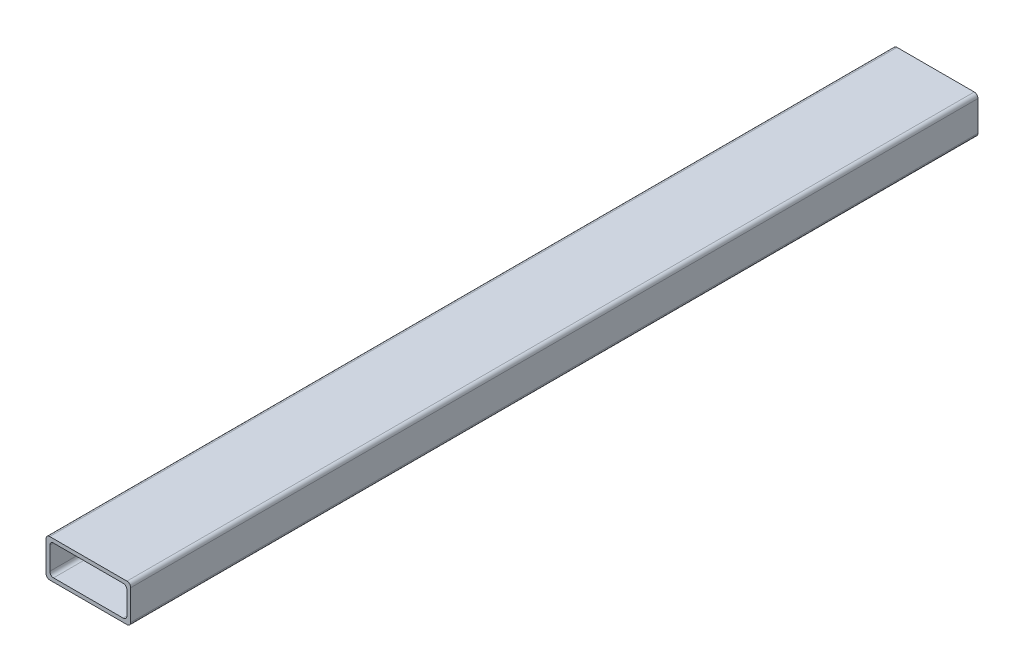
ISO-10303-21;
HEADER;
FILE_DESCRIPTION(('STEP AP214'),'2;1');
FILE_NAME('part.step','',(''),(''),'','','');
FILE_SCHEMA(('AUTOMOTIVE_DESIGN { 1 0 10303 214 1 1 1 1 }'));
ENDSEC;
DATA;
#1=APPLICATION_CONTEXT('core data for automotive mechanical design processes');
#2=APPLICATION_PROTOCOL_DEFINITION('international standard','automotive_design',2000,#1);
#3=PRODUCT_CONTEXT('',#1,'mechanical');
#4=PRODUCT('Part','Part','',(#3));
#5=PRODUCT_RELATED_PRODUCT_CATEGORY('part','',(#4));
#6=PRODUCT_DEFINITION_FORMATION('','',#4);
#7=PRODUCT_DEFINITION_CONTEXT('part definition',#1,'design');
#8=PRODUCT_DEFINITION('design','',#6,#7);
#9=PRODUCT_DEFINITION_SHAPE('','',#8);
#10=(LENGTH_UNIT() NAMED_UNIT(*) SI_UNIT(.MILLI.,.METRE.));
#11=(NAMED_UNIT(*) PLANE_ANGLE_UNIT() SI_UNIT($,.RADIAN.));
#12=(NAMED_UNIT(*) SI_UNIT($,.STERADIAN.) SOLID_ANGLE_UNIT());
#13=UNCERTAINTY_MEASURE_WITH_UNIT(LENGTH_MEASURE(1.E-05),#10,'distance_accuracy_value','');
#14=(GEOMETRIC_REPRESENTATION_CONTEXT(3) GLOBAL_UNCERTAINTY_ASSIGNED_CONTEXT((#13)) GLOBAL_UNIT_ASSIGNED_CONTEXT((#10,
#11,#12)) REPRESENTATION_CONTEXT('',''));
#15=CARTESIAN_POINT('',(0.,0.,0.));
#16=DIRECTION('',(0.,0.,1.));
#17=DIRECTION('',(1.,0.,0.));
#18=AXIS2_PLACEMENT_3D('',#15,#16,#17);
#19=CARTESIAN_POINT('',(-67.0781194232168,25.7326253085691,450.));
#20=DIRECTION('',(0.,0.,1.));
#21=DIRECTION('',(1.,0.,0.));
#22=AXIS2_PLACEMENT_3D('',#19,#20,#21);
#23=PLANE('',#22);
#24=CARTESIAN_POINT('',(-67.0781194232168,25.7326253085691,450.));
#25=DIRECTION('',(0.,0.,1.));
#26=DIRECTION('',(1.,0.,0.));
#27=AXIS2_PLACEMENT_3D('',#24,#25,#26);
#28=CIRCLE('',#27,2.);
#29=CARTESIAN_POINT('',(-67.0781194232168,27.7326253085691,450.));
#30=VERTEX_POINT('',#29);
#31=CARTESIAN_POINT('',(-69.0781194232168,25.732625308569,450.));
#32=VERTEX_POINT('',#31);
#33=EDGE_CURVE('E210',#30,#32,#28,.T.);
#34=ORIENTED_EDGE('',*,*,#33,.T.);
#35=DIRECTION('',(0.,-1.,0.));
#36=VECTOR('',#35,1.);
#37=CARTESIAN_POINT('',(-69.0781194232168,9.73262530856907,450.));
#38=LINE('',#37,#36);
#39=CARTESIAN_POINT('',(-69.0781194232168,9.73262530856907,450.));
#40=VERTEX_POINT('',#39);
#41=EDGE_CURVE('E213',#32,#40,#38,.T.);
#42=ORIENTED_EDGE('',*,*,#41,.T.);
#43=CARTESIAN_POINT('',(-67.0781194232168,9.73262530856905,450.));
#44=DIRECTION('',(0.,0.,1.));
#45=DIRECTION('',(1.,0.,0.));
#46=AXIS2_PLACEMENT_3D('',#43,#44,#45);
#47=CIRCLE('',#46,2.);
#48=CARTESIAN_POINT('',(-67.0781194232168,7.73262530856905,450.));
#49=VERTEX_POINT('',#48);
#50=EDGE_CURVE('E216',#40,#49,#47,.T.);
#51=ORIENTED_EDGE('',*,*,#50,.T.);
#52=DIRECTION('',(1.,0.,0.));
#53=VECTOR('',#52,1.);
#54=CARTESIAN_POINT('',(-67.0781194232168,7.73262530856905,450.));
#55=LINE('',#54,#53);
#56=CARTESIAN_POINT('',(-26.0781194232169,7.73262530856905,450.));
#57=VERTEX_POINT('',#56);
#58=EDGE_CURVE('E218',#49,#57,#55,.T.);
#59=ORIENTED_EDGE('',*,*,#58,.T.);
#60=CARTESIAN_POINT('',(-26.0781194232168,9.73262530856905,450.));
#61=DIRECTION('',(0.,0.,1.));
#62=DIRECTION('',(1.,0.,0.));
#63=AXIS2_PLACEMENT_3D('',#60,#61,#62);
#64=CIRCLE('',#63,2.);
#65=CARTESIAN_POINT('',(-24.0781194232168,9.73262530856907,450.));
#66=VERTEX_POINT('',#65);
#67=EDGE_CURVE('E220',#57,#66,#64,.T.);
#68=ORIENTED_EDGE('',*,*,#67,.T.);
#69=DIRECTION('',(0.,1.,0.));
#70=VECTOR('',#69,1.);
#71=CARTESIAN_POINT('',(-24.0781194232168,25.732625308569,450.));
#72=LINE('',#71,#70);
#73=CARTESIAN_POINT('',(-24.0781194232168,25.732625308569,450.));
#74=VERTEX_POINT('',#73);
#75=EDGE_CURVE('E222',#66,#74,#72,.T.);
#76=ORIENTED_EDGE('',*,*,#75,.T.);
#77=CARTESIAN_POINT('',(-26.0781194232168,25.7326253085691,450.));
#78=DIRECTION('',(0.,0.,1.));
#79=DIRECTION('',(1.,0.,0.));
#80=AXIS2_PLACEMENT_3D('',#77,#78,#79);
#81=CIRCLE('',#80,2.);
#82=CARTESIAN_POINT('',(-26.0781194232169,27.7326253085691,450.));
#83=VERTEX_POINT('',#82);
#84=EDGE_CURVE('E224',#74,#83,#81,.T.);
#85=ORIENTED_EDGE('',*,*,#84,.T.);
#86=DIRECTION('',(-1.,0.,0.));
#87=VECTOR('',#86,1.);
#88=CARTESIAN_POINT('',(-67.0781194232168,27.7326253085691,450.));
#89=LINE('',#88,#87);
#90=EDGE_CURVE('E226',#83,#30,#89,.T.);
#91=ORIENTED_EDGE('',*,*,#90,.T.);
#92=EDGE_LOOP('',(#34,#42,#51,#59,#68,#76,#85,#91));
#93=FACE_BOUND('',#92,.T.);
#94=DIRECTION('',(0.,-1.,0.));
#95=VECTOR('',#94,1.);
#96=CARTESIAN_POINT('',(-67.0781194232168,11.7326253085691,450.));
#97=LINE('',#96,#95);
#98=CARTESIAN_POINT('',(-67.0781194232168,23.732625308569,450.));
#99=VERTEX_POINT('',#98);
#100=CARTESIAN_POINT('',(-67.0781194232168,11.7326253085691,450.));
#101=VERTEX_POINT('',#100);
#102=EDGE_CURVE('E153',#99,#101,#97,.T.);
#103=ORIENTED_EDGE('',*,*,#102,.F.);
#104=CARTESIAN_POINT('',(-65.0781194232168,23.7326253085691,450.));
#105=DIRECTION('',(0.,0.,1.));
#106=DIRECTION('',(1.,0.,0.));
#107=AXIS2_PLACEMENT_3D('',#104,#105,#106);
#108=CIRCLE('',#107,2.);
#109=CARTESIAN_POINT('',(-65.0781194232168,25.7326253085691,450.));
#110=VERTEX_POINT('',#109);
#111=EDGE_CURVE('E145',#110,#99,#108,.T.);
#112=ORIENTED_EDGE('',*,*,#111,.F.);
#113=DIRECTION('',(-1.,0.,0.));
#114=VECTOR('',#113,1.);
#115=CARTESIAN_POINT('',(-65.0781194232168,25.7326253085691,450.));
#116=LINE('',#115,#114);
#117=CARTESIAN_POINT('',(-28.0781194232169,25.7326253085691,450.));
#118=VERTEX_POINT('',#117);
#119=EDGE_CURVE('E178',#118,#110,#116,.T.);
#120=ORIENTED_EDGE('',*,*,#119,.F.);
#121=CARTESIAN_POINT('',(-28.0781194232168,23.7326253085691,450.));
#122=DIRECTION('',(0.,0.,1.));
#123=DIRECTION('',(1.,0.,0.));
#124=AXIS2_PLACEMENT_3D('',#121,#122,#123);
#125=CIRCLE('',#124,2.);
#126=CARTESIAN_POINT('',(-26.0781194232168,23.732625308569,450.));
#127=VERTEX_POINT('',#126);
#128=EDGE_CURVE('E176',#127,#118,#125,.T.);
#129=ORIENTED_EDGE('',*,*,#128,.F.);
#130=DIRECTION('',(0.,1.,0.));
#131=VECTOR('',#130,1.);
#132=CARTESIAN_POINT('',(-26.0781194232168,23.732625308569,450.));
#133=LINE('',#132,#131);
#134=CARTESIAN_POINT('',(-26.0781194232168,11.7326253085691,450.));
#135=VERTEX_POINT('',#134);
#136=EDGE_CURVE('E174',#135,#127,#133,.T.);
#137=ORIENTED_EDGE('',*,*,#136,.F.);
#138=CARTESIAN_POINT('',(-28.0781194232168,11.7326253085691,450.));
#139=DIRECTION('',(0.,0.,1.));
#140=DIRECTION('',(1.,0.,0.));
#141=AXIS2_PLACEMENT_3D('',#138,#139,#140);
#142=CIRCLE('',#141,2.);
#143=CARTESIAN_POINT('',(-28.0781194232169,9.73262530856905,450.));
#144=VERTEX_POINT('',#143);
#145=EDGE_CURVE('E172',#144,#135,#142,.T.);
#146=ORIENTED_EDGE('',*,*,#145,.F.);
#147=DIRECTION('',(1.,0.,0.));
#148=VECTOR('',#147,1.);
#149=CARTESIAN_POINT('',(-65.0781194232168,9.73262530856905,450.));
#150=LINE('',#149,#148);
#151=CARTESIAN_POINT('',(-65.0781194232168,9.73262530856905,450.));
#152=VERTEX_POINT('',#151);
#153=EDGE_CURVE('E168',#152,#144,#150,.T.);
#154=ORIENTED_EDGE('',*,*,#153,.F.);
#155=CARTESIAN_POINT('',(-65.0781194232168,11.7326253085691,450.));
#156=DIRECTION('',(0.,0.,1.));
#157=DIRECTION('',(1.,0.,0.));
#158=AXIS2_PLACEMENT_3D('',#155,#156,#157);
#159=CIRCLE('',#158,2.);
#160=EDGE_CURVE('E166',#101,#152,#159,.T.);
#161=ORIENTED_EDGE('',*,*,#160,.F.);
#162=EDGE_LOOP('',(#103,#112,#120,#129,#137,#146,#154,#161));
#163=FACE_BOUND('',#162,.T.);
#164=ADVANCED_FACE('F32',(#93,#163),#23,.T.);
#165=CARTESIAN_POINT('',(-67.0781194232168,25.7326253085691,0.));
#166=DIRECTION('',(0.,0.,1.));
#167=DIRECTION('',(1.,0.,0.));
#168=AXIS2_PLACEMENT_3D('',#165,#166,#167);
#169=PLANE('',#168);
#170=CARTESIAN_POINT('',(-67.0781194232168,25.7326253085691,0.));
#171=DIRECTION('',(0.,0.,1.));
#172=DIRECTION('',(1.,0.,0.));
#173=AXIS2_PLACEMENT_3D('',#170,#171,#172);
#174=CIRCLE('',#173,2.);
#175=CARTESIAN_POINT('',(-67.0781194232168,27.7326253085691,0.));
#176=VERTEX_POINT('',#175);
#177=CARTESIAN_POINT('',(-69.0781194232168,25.732625308569,0.));
#178=VERTEX_POINT('',#177);
#179=EDGE_CURVE('E161',#176,#178,#174,.T.);
#180=ORIENTED_EDGE('',*,*,#179,.F.);
#181=DIRECTION('',(-1.,0.,0.));
#182=VECTOR('',#181,1.);
#183=CARTESIAN_POINT('',(-67.0781194232168,27.7326253085691,0.));
#184=LINE('',#183,#182);
#185=CARTESIAN_POINT('',(-26.0781194232169,27.7326253085691,0.));
#186=VERTEX_POINT('',#185);
#187=EDGE_CURVE('E214',#186,#176,#184,.T.);
#188=ORIENTED_EDGE('',*,*,#187,.F.);
#189=CARTESIAN_POINT('',(-26.0781194232168,25.7326253085691,0.));
#190=DIRECTION('',(0.,0.,1.));
#191=DIRECTION('',(1.,0.,0.));
#192=AXIS2_PLACEMENT_3D('',#189,#190,#191);
#193=CIRCLE('',#192,2.);
#194=CARTESIAN_POINT('',(-24.0781194232168,25.732625308569,0.));
#195=VERTEX_POINT('',#194);
#196=EDGE_CURVE('E241',#195,#186,#193,.T.);
#197=ORIENTED_EDGE('',*,*,#196,.F.);
#198=DIRECTION('',(0.,1.,0.));
#199=VECTOR('',#198,1.);
#200=CARTESIAN_POINT('',(-24.0781194232168,25.732625308569,0.));
#201=LINE('',#200,#199);
#202=CARTESIAN_POINT('',(-24.0781194232168,9.73262530856907,0.));
#203=VERTEX_POINT('',#202);
#204=EDGE_CURVE('E239',#203,#195,#201,.T.);
#205=ORIENTED_EDGE('',*,*,#204,.F.);
#206=CARTESIAN_POINT('',(-26.0781194232168,9.73262530856905,0.));
#207=DIRECTION('',(0.,0.,1.));
#208=DIRECTION('',(1.,0.,0.));
#209=AXIS2_PLACEMENT_3D('',#206,#207,#208);
#210=CIRCLE('',#209,2.);
#211=CARTESIAN_POINT('',(-26.0781194232169,7.73262530856905,0.));
#212=VERTEX_POINT('',#211);
#213=EDGE_CURVE('E237',#212,#203,#210,.T.);
#214=ORIENTED_EDGE('',*,*,#213,.F.);
#215=DIRECTION('',(1.,0.,0.));
#216=VECTOR('',#215,1.);
#217=CARTESIAN_POINT('',(-67.0781194232168,7.73262530856905,0.));
#218=LINE('',#217,#216);
#219=CARTESIAN_POINT('',(-67.0781194232168,7.73262530856905,0.));
#220=VERTEX_POINT('',#219);
#221=EDGE_CURVE('E235',#220,#212,#218,.T.);
#222=ORIENTED_EDGE('',*,*,#221,.F.);
#223=CARTESIAN_POINT('',(-67.0781194232168,9.73262530856905,0.));
#224=DIRECTION('',(0.,0.,1.));
#225=DIRECTION('',(1.,0.,0.));
#226=AXIS2_PLACEMENT_3D('',#223,#224,#225);
#227=CIRCLE('',#226,2.);
#228=CARTESIAN_POINT('',(-69.0781194232168,9.73262530856907,0.));
#229=VERTEX_POINT('',#228);
#230=EDGE_CURVE('E233',#229,#220,#227,.T.);
#231=ORIENTED_EDGE('',*,*,#230,.F.);
#232=DIRECTION('',(0.,-1.,0.));
#233=VECTOR('',#232,1.);
#234=CARTESIAN_POINT('',(-69.0781194232168,9.73262530856907,0.));
#235=LINE('',#234,#233);
#236=EDGE_CURVE('E231',#178,#229,#235,.T.);
#237=ORIENTED_EDGE('',*,*,#236,.F.);
#238=EDGE_LOOP('',(#180,#188,#197,#205,#214,#222,#231,#237));
#239=FACE_BOUND('',#238,.T.);
#240=CARTESIAN_POINT('',(-65.0781194232168,23.7326253085691,0.));
#241=DIRECTION('',(0.,0.,1.));
#242=DIRECTION('',(1.,0.,0.));
#243=AXIS2_PLACEMENT_3D('',#240,#241,#242);
#244=CIRCLE('',#243,2.);
#245=CARTESIAN_POINT('',(-65.0781194232168,25.7326253085691,0.));
#246=VERTEX_POINT('',#245);
#247=CARTESIAN_POINT('',(-67.0781194232168,23.732625308569,0.));
#248=VERTEX_POINT('',#247);
#249=EDGE_CURVE('E55',#246,#248,#244,.T.);
#250=ORIENTED_EDGE('',*,*,#249,.T.);
#251=DIRECTION('',(0.,-1.,0.));
#252=VECTOR('',#251,1.);
#253=CARTESIAN_POINT('',(-67.0781194232168,11.7326253085691,0.));
#254=LINE('',#253,#252);
#255=CARTESIAN_POINT('',(-67.0781194232168,11.7326253085691,0.));
#256=VERTEX_POINT('',#255);
#257=EDGE_CURVE('E160',#248,#256,#254,.T.);
#258=ORIENTED_EDGE('',*,*,#257,.T.);
#259=CARTESIAN_POINT('',(-65.0781194232168,11.7326253085691,0.));
#260=DIRECTION('',(0.,0.,1.));
#261=DIRECTION('',(1.,0.,0.));
#262=AXIS2_PLACEMENT_3D('',#259,#260,#261);
#263=CIRCLE('',#262,2.);
#264=CARTESIAN_POINT('',(-65.0781194232168,9.73262530856905,0.));
#265=VERTEX_POINT('',#264);
#266=EDGE_CURVE('E182',#256,#265,#263,.T.);
#267=ORIENTED_EDGE('',*,*,#266,.T.);
#268=DIRECTION('',(1.,0.,0.));
#269=VECTOR('',#268,1.);
#270=CARTESIAN_POINT('',(-65.0781194232168,9.73262530856905,0.));
#271=LINE('',#270,#269);
#272=CARTESIAN_POINT('',(-28.0781194232169,9.73262530856905,0.));
#273=VERTEX_POINT('',#272);
#274=EDGE_CURVE('E185',#265,#273,#271,.T.);
#275=ORIENTED_EDGE('',*,*,#274,.T.);
#276=CARTESIAN_POINT('',(-28.0781194232168,11.7326253085691,0.));
#277=DIRECTION('',(0.,0.,1.));
#278=DIRECTION('',(1.,0.,0.));
#279=AXIS2_PLACEMENT_3D('',#276,#277,#278);
#280=CIRCLE('',#279,2.);
#281=CARTESIAN_POINT('',(-26.0781194232168,11.7326253085691,0.));
#282=VERTEX_POINT('',#281);
#283=EDGE_CURVE('E188',#273,#282,#280,.T.);
#284=ORIENTED_EDGE('',*,*,#283,.T.);
#285=DIRECTION('',(0.,1.,0.));
#286=VECTOR('',#285,1.);
#287=CARTESIAN_POINT('',(-26.0781194232168,23.732625308569,0.));
#288=LINE('',#287,#286);
#289=CARTESIAN_POINT('',(-26.0781194232168,23.732625308569,0.));
#290=VERTEX_POINT('',#289);
#291=EDGE_CURVE('E191',#282,#290,#288,.T.);
#292=ORIENTED_EDGE('',*,*,#291,.T.);
#293=CARTESIAN_POINT('',(-28.0781194232168,23.7326253085691,0.));
#294=DIRECTION('',(0.,0.,1.));
#295=DIRECTION('',(1.,0.,0.));
#296=AXIS2_PLACEMENT_3D('',#293,#294,#295);
#297=CIRCLE('',#296,2.);
#298=CARTESIAN_POINT('',(-28.0781194232169,25.7326253085691,0.));
#299=VERTEX_POINT('',#298);
#300=EDGE_CURVE('E194',#290,#299,#297,.T.);
#301=ORIENTED_EDGE('',*,*,#300,.T.);
#302=DIRECTION('',(-1.,0.,0.));
#303=VECTOR('',#302,1.);
#304=CARTESIAN_POINT('',(-65.0781194232168,25.7326253085691,0.));
#305=LINE('',#304,#303);
#306=EDGE_CURVE('E154',#299,#246,#305,.T.);
#307=ORIENTED_EDGE('',*,*,#306,.T.);
#308=EDGE_LOOP('',(#250,#258,#267,#275,#284,#292,#301,#307));
#309=FACE_BOUND('',#308,.T.);
#310=ADVANCED_FACE('F271',(#239,#309),#169,.F.);
#311=CARTESIAN_POINT('',(-67.0781194232168,25.7326253085691,450.));
#312=DIRECTION('',(0.,0.,-1.));
#313=DIRECTION('',(-1.,0.,0.));
#314=AXIS2_PLACEMENT_3D('',#311,#312,#313);
#315=CYLINDRICAL_SURFACE('',#314,2.);
#316=ORIENTED_EDGE('',*,*,#179,.T.);
#317=DIRECTION('',(0.,0.,-1.));
#318=VECTOR('',#317,1.);
#319=CARTESIAN_POINT('',(-69.0781194232168,25.732625308569,450.));
#320=LINE('',#319,#318);
#321=EDGE_CURVE('E11',#32,#178,#320,.T.);
#322=ORIENTED_EDGE('',*,*,#321,.F.);
#323=ORIENTED_EDGE('',*,*,#33,.F.);
#324=DIRECTION('',(0.,0.,-1.));
#325=VECTOR('',#324,1.);
#326=CARTESIAN_POINT('',(-67.0781194232168,27.7326253085691,450.));
#327=LINE('',#326,#325);
#328=EDGE_CURVE('E228',#30,#176,#327,.T.);
#329=ORIENTED_EDGE('',*,*,#328,.T.);
#330=EDGE_LOOP('',(#316,#322,#323,#329));
#331=FACE_BOUND('',#330,.T.);
#332=ADVANCED_FACE('F34',(#331),#315,.T.);
#333=CARTESIAN_POINT('',(-69.0781194232168,9.73262530856907,450.));
#334=DIRECTION('',(1.,0.,0.));
#335=DIRECTION('',(0.,0.,-1.));
#336=AXIS2_PLACEMENT_3D('',#333,#334,#335);
#337=PLANE('',#336);
#338=ORIENTED_EDGE('',*,*,#236,.T.);
#339=DIRECTION('',(0.,0.,-1.));
#340=VECTOR('',#339,1.);
#341=CARTESIAN_POINT('',(-69.0781194232168,9.73262530856907,450.));
#342=LINE('',#341,#340);
#343=EDGE_CURVE('E40',#40,#229,#342,.T.);
#344=ORIENTED_EDGE('',*,*,#343,.F.);
#345=ORIENTED_EDGE('',*,*,#41,.F.);
#346=ORIENTED_EDGE('',*,*,#321,.T.);
#347=EDGE_LOOP('',(#338,#344,#345,#346));
#348=FACE_BOUND('',#347,.T.);
#349=ADVANCED_FACE('F288',(#348),#337,.F.);
#350=CARTESIAN_POINT('',(-67.0781194232168,9.73262530856905,450.));
#351=DIRECTION('',(0.,0.,-1.));
#352=DIRECTION('',(-1.,0.,0.));
#353=AXIS2_PLACEMENT_3D('',#350,#351,#352);
#354=CYLINDRICAL_SURFACE('',#353,2.);
#355=ORIENTED_EDGE('',*,*,#230,.T.);
#356=DIRECTION('',(0.,0.,-1.));
#357=VECTOR('',#356,1.);
#358=CARTESIAN_POINT('',(-67.0781194232168,7.73262530856905,450.));
#359=LINE('',#358,#357);
#360=EDGE_CURVE('E258',#49,#220,#359,.T.);
#361=ORIENTED_EDGE('',*,*,#360,.F.);
#362=ORIENTED_EDGE('',*,*,#50,.F.);
#363=ORIENTED_EDGE('',*,*,#343,.T.);
#364=EDGE_LOOP('',(#355,#361,#362,#363));
#365=FACE_BOUND('',#364,.T.);
#366=ADVANCED_FACE('F265',(#365),#354,.T.);
#367=CARTESIAN_POINT('',(-67.0781194232168,7.73262530856905,450.));
#368=DIRECTION('',(0.,1.,0.));
#369=DIRECTION('',(0.,0.,1.));
#370=AXIS2_PLACEMENT_3D('',#367,#368,#369);
#371=PLANE('',#370);
#372=ORIENTED_EDGE('',*,*,#221,.T.);
#373=DIRECTION('',(0.,0.,-1.));
#374=VECTOR('',#373,1.);
#375=CARTESIAN_POINT('',(-26.0781194232169,7.73262530856905,450.));
#376=LINE('',#375,#374);
#377=EDGE_CURVE('E255',#57,#212,#376,.T.);
#378=ORIENTED_EDGE('',*,*,#377,.F.);
#379=ORIENTED_EDGE('',*,*,#58,.F.);
#380=ORIENTED_EDGE('',*,*,#360,.T.);
#381=EDGE_LOOP('',(#372,#378,#379,#380));
#382=FACE_BOUND('',#381,.T.);
#383=ADVANCED_FACE('F277',(#382),#371,.F.);
#384=CARTESIAN_POINT('',(-26.0781194232168,9.73262530856905,450.));
#385=DIRECTION('',(0.,0.,-1.));
#386=DIRECTION('',(-1.,0.,0.));
#387=AXIS2_PLACEMENT_3D('',#384,#385,#386);
#388=CYLINDRICAL_SURFACE('',#387,2.);
#389=ORIENTED_EDGE('',*,*,#213,.T.);
#390=DIRECTION('',(0.,0.,-1.));
#391=VECTOR('',#390,1.);
#392=CARTESIAN_POINT('',(-24.0781194232168,9.73262530856907,450.));
#393=LINE('',#392,#391);
#394=EDGE_CURVE('E252',#66,#203,#393,.T.);
#395=ORIENTED_EDGE('',*,*,#394,.F.);
#396=ORIENTED_EDGE('',*,*,#67,.F.);
#397=ORIENTED_EDGE('',*,*,#377,.T.);
#398=EDGE_LOOP('',(#389,#395,#396,#397));
#399=FACE_BOUND('',#398,.T.);
#400=ADVANCED_FACE('F281',(#399),#388,.T.);
#401=CARTESIAN_POINT('',(-24.0781194232168,25.732625308569,450.));
#402=DIRECTION('',(-1.,0.,0.));
#403=DIRECTION('',(0.,0.,1.));
#404=AXIS2_PLACEMENT_3D('',#401,#402,#403);
#405=PLANE('',#404);
#406=ORIENTED_EDGE('',*,*,#204,.T.);
#407=DIRECTION('',(0.,0.,-1.));
#408=VECTOR('',#407,1.);
#409=CARTESIAN_POINT('',(-24.0781194232168,25.732625308569,450.));
#410=LINE('',#409,#408);
#411=EDGE_CURVE('E249',#74,#195,#410,.T.);
#412=ORIENTED_EDGE('',*,*,#411,.F.);
#413=ORIENTED_EDGE('',*,*,#75,.F.);
#414=ORIENTED_EDGE('',*,*,#394,.T.);
#415=EDGE_LOOP('',(#406,#412,#413,#414));
#416=FACE_BOUND('',#415,.T.);
#417=ADVANCED_FACE('F301',(#416),#405,.F.);
#418=CARTESIAN_POINT('',(-26.0781194232168,25.7326253085691,450.));
#419=DIRECTION('',(0.,0.,-1.));
#420=DIRECTION('',(-1.,0.,0.));
#421=AXIS2_PLACEMENT_3D('',#418,#419,#420);
#422=CYLINDRICAL_SURFACE('',#421,2.);
#423=ORIENTED_EDGE('',*,*,#196,.T.);
#424=DIRECTION('',(0.,0.,-1.));
#425=VECTOR('',#424,1.);
#426=CARTESIAN_POINT('',(-26.0781194232169,27.7326253085691,450.));
#427=LINE('',#426,#425);
#428=EDGE_CURVE('E246',#83,#186,#427,.T.);
#429=ORIENTED_EDGE('',*,*,#428,.F.);
#430=ORIENTED_EDGE('',*,*,#84,.F.);
#431=ORIENTED_EDGE('',*,*,#411,.T.);
#432=EDGE_LOOP('',(#423,#429,#430,#431));
#433=FACE_BOUND('',#432,.T.);
#434=ADVANCED_FACE('F299',(#433),#422,.T.);
#435=CARTESIAN_POINT('',(-67.0781194232168,27.7326253085691,450.));
#436=DIRECTION('',(0.,-1.,0.));
#437=DIRECTION('',(0.,0.,-1.));
#438=AXIS2_PLACEMENT_3D('',#435,#436,#437);
#439=PLANE('',#438);
#440=ORIENTED_EDGE('',*,*,#187,.T.);
#441=ORIENTED_EDGE('',*,*,#328,.F.);
#442=ORIENTED_EDGE('',*,*,#90,.F.);
#443=ORIENTED_EDGE('',*,*,#428,.T.);
#444=EDGE_LOOP('',(#440,#441,#442,#443));
#445=FACE_BOUND('',#444,.T.);
#446=ADVANCED_FACE('F294',(#445),#439,.F.);
#447=CARTESIAN_POINT('',(-65.0781194232168,23.7326253085691,450.));
#448=DIRECTION('',(0.,0.,-1.));
#449=DIRECTION('',(-1.,0.,0.));
#450=AXIS2_PLACEMENT_3D('',#447,#448,#449);
#451=CYLINDRICAL_SURFACE('',#450,2.);
#452=ORIENTED_EDGE('',*,*,#249,.F.);
#453=DIRECTION('',(0.,0.,-1.));
#454=VECTOR('',#453,1.);
#455=CARTESIAN_POINT('',(-65.0781194232168,25.7326253085691,450.));
#456=LINE('',#455,#454);
#457=EDGE_CURVE('E149',#110,#246,#456,.T.);
#458=ORIENTED_EDGE('',*,*,#457,.F.);
#459=ORIENTED_EDGE('',*,*,#111,.T.);
#460=DIRECTION('',(0.,0.,-1.));
#461=VECTOR('',#460,1.);
#462=CARTESIAN_POINT('',(-67.0781194232168,23.732625308569,450.));
#463=LINE('',#462,#461);
#464=EDGE_CURVE('E148',#99,#248,#463,.T.);
#465=ORIENTED_EDGE('',*,*,#464,.T.);
#466=EDGE_LOOP('',(#452,#458,#459,#465));
#467=FACE_BOUND('',#466,.T.);
#468=ADVANCED_FACE('F147',(#467),#451,.F.);
#469=CARTESIAN_POINT('',(-67.0781194232168,11.7326253085691,450.));
#470=DIRECTION('',(1.,0.,0.));
#471=DIRECTION('',(0.,0.,-1.));
#472=AXIS2_PLACEMENT_3D('',#469,#470,#471);
#473=PLANE('',#472);
#474=ORIENTED_EDGE('',*,*,#257,.F.);
#475=ORIENTED_EDGE('',*,*,#464,.F.);
#476=ORIENTED_EDGE('',*,*,#102,.T.);
#477=DIRECTION('',(0.,0.,-1.));
#478=VECTOR('',#477,1.);
#479=CARTESIAN_POINT('',(-67.0781194232168,11.7326253085691,450.));
#480=LINE('',#479,#478);
#481=EDGE_CURVE('E162',#101,#256,#480,.T.);
#482=ORIENTED_EDGE('',*,*,#481,.T.);
#483=EDGE_LOOP('',(#474,#475,#476,#482));
#484=FACE_BOUND('',#483,.T.);
#485=ADVANCED_FACE('F157',(#484),#473,.T.);
#486=CARTESIAN_POINT('',(-65.0781194232168,11.7326253085691,450.));
#487=DIRECTION('',(0.,0.,-1.));
#488=DIRECTION('',(-1.,0.,0.));
#489=AXIS2_PLACEMENT_3D('',#486,#487,#488);
#490=CYLINDRICAL_SURFACE('',#489,2.);
#491=ORIENTED_EDGE('',*,*,#266,.F.);
#492=ORIENTED_EDGE('',*,*,#481,.F.);
#493=ORIENTED_EDGE('',*,*,#160,.T.);
#494=DIRECTION('',(0.,0.,-1.));
#495=VECTOR('',#494,1.);
#496=CARTESIAN_POINT('',(-65.0781194232168,9.73262530856905,450.));
#497=LINE('',#496,#495);
#498=EDGE_CURVE('E207',#152,#265,#497,.T.);
#499=ORIENTED_EDGE('',*,*,#498,.T.);
#500=EDGE_LOOP('',(#491,#492,#493,#499));
#501=FACE_BOUND('',#500,.T.);
#502=ADVANCED_FACE('F326',(#501),#490,.F.);
#503=CARTESIAN_POINT('',(-65.0781194232168,9.73262530856905,450.));
#504=DIRECTION('',(0.,1.,0.));
#505=DIRECTION('',(0.,0.,1.));
#506=AXIS2_PLACEMENT_3D('',#503,#504,#505);
#507=PLANE('',#506);
#508=ORIENTED_EDGE('',*,*,#274,.F.);
#509=ORIENTED_EDGE('',*,*,#498,.F.);
#510=ORIENTED_EDGE('',*,*,#153,.T.);
#511=DIRECTION('',(0.,0.,-1.));
#512=VECTOR('',#511,1.);
#513=CARTESIAN_POINT('',(-28.0781194232169,9.73262530856905,450.));
#514=LINE('',#513,#512);
#515=EDGE_CURVE('E205',#144,#273,#514,.T.);
#516=ORIENTED_EDGE('',*,*,#515,.T.);
#517=EDGE_LOOP('',(#508,#509,#510,#516));
#518=FACE_BOUND('',#517,.T.);
#519=ADVANCED_FACE('F330',(#518),#507,.T.);
#520=CARTESIAN_POINT('',(-28.0781194232168,11.7326253085691,450.));
#521=DIRECTION('',(0.,0.,-1.));
#522=DIRECTION('',(-1.,0.,0.));
#523=AXIS2_PLACEMENT_3D('',#520,#521,#522);
#524=CYLINDRICAL_SURFACE('',#523,2.);
#525=ORIENTED_EDGE('',*,*,#283,.F.);
#526=ORIENTED_EDGE('',*,*,#515,.F.);
#527=ORIENTED_EDGE('',*,*,#145,.T.);
#528=DIRECTION('',(0.,0.,-1.));
#529=VECTOR('',#528,1.);
#530=CARTESIAN_POINT('',(-26.0781194232168,11.7326253085691,450.));
#531=LINE('',#530,#529);
#532=EDGE_CURVE('E203',#135,#282,#531,.T.);
#533=ORIENTED_EDGE('',*,*,#532,.T.);
#534=EDGE_LOOP('',(#525,#526,#527,#533));
#535=FACE_BOUND('',#534,.T.);
#536=ADVANCED_FACE('F336',(#535),#524,.F.);
#537=CARTESIAN_POINT('',(-26.0781194232168,23.732625308569,450.));
#538=DIRECTION('',(-1.,0.,0.));
#539=DIRECTION('',(0.,0.,1.));
#540=AXIS2_PLACEMENT_3D('',#537,#538,#539);
#541=PLANE('',#540);
#542=ORIENTED_EDGE('',*,*,#291,.F.);
#543=ORIENTED_EDGE('',*,*,#532,.F.);
#544=ORIENTED_EDGE('',*,*,#136,.T.);
#545=DIRECTION('',(0.,0.,-1.));
#546=VECTOR('',#545,1.);
#547=CARTESIAN_POINT('',(-26.0781194232168,23.732625308569,450.));
#548=LINE('',#547,#546);
#549=EDGE_CURVE('E201',#127,#290,#548,.T.);
#550=ORIENTED_EDGE('',*,*,#549,.T.);
#551=EDGE_LOOP('',(#542,#543,#544,#550));
#552=FACE_BOUND('',#551,.T.);
#553=ADVANCED_FACE('F340',(#552),#541,.T.);
#554=CARTESIAN_POINT('',(-28.0781194232168,23.7326253085691,450.));
#555=DIRECTION('',(0.,0.,-1.));
#556=DIRECTION('',(-1.,0.,0.));
#557=AXIS2_PLACEMENT_3D('',#554,#555,#556);
#558=CYLINDRICAL_SURFACE('',#557,2.);
#559=ORIENTED_EDGE('',*,*,#300,.F.);
#560=ORIENTED_EDGE('',*,*,#549,.F.);
#561=ORIENTED_EDGE('',*,*,#128,.T.);
#562=DIRECTION('',(0.,0.,-1.));
#563=VECTOR('',#562,1.);
#564=CARTESIAN_POINT('',(-28.0781194232169,25.7326253085691,450.));
#565=LINE('',#564,#563);
#566=EDGE_CURVE('E47',#118,#299,#565,.T.);
#567=ORIENTED_EDGE('',*,*,#566,.T.);
#568=EDGE_LOOP('',(#559,#560,#561,#567));
#569=FACE_BOUND('',#568,.T.);
#570=ADVANCED_FACE('F344',(#569),#558,.F.);
#571=CARTESIAN_POINT('',(-65.0781194232168,25.7326253085691,450.));
#572=DIRECTION('',(0.,-1.,0.));
#573=DIRECTION('',(0.,0.,-1.));
#574=AXIS2_PLACEMENT_3D('',#571,#572,#573);
#575=PLANE('',#574);
#576=ORIENTED_EDGE('',*,*,#306,.F.);
#577=ORIENTED_EDGE('',*,*,#566,.F.);
#578=ORIENTED_EDGE('',*,*,#119,.T.);
#579=ORIENTED_EDGE('',*,*,#457,.T.);
#580=EDGE_LOOP('',(#576,#577,#578,#579));
#581=FACE_BOUND('',#580,.T.);
#582=ADVANCED_FACE('F348',(#581),#575,.T.);
#583=CLOSED_SHELL('',(#164,#310,#332,#349,#366,#383,#400,#417,#434,#446,#468,#485,#502,#519,
#536,#553,#570,#582));
#584=MANIFOLD_SOLID_BREP('B2',#583);
#585=ADVANCED_BREP_SHAPE_REPRESENTATION('',(#18,#584),#14);
#586=SHAPE_DEFINITION_REPRESENTATION(#9,#585);
ENDSEC;
END-ISO-10303-21;
